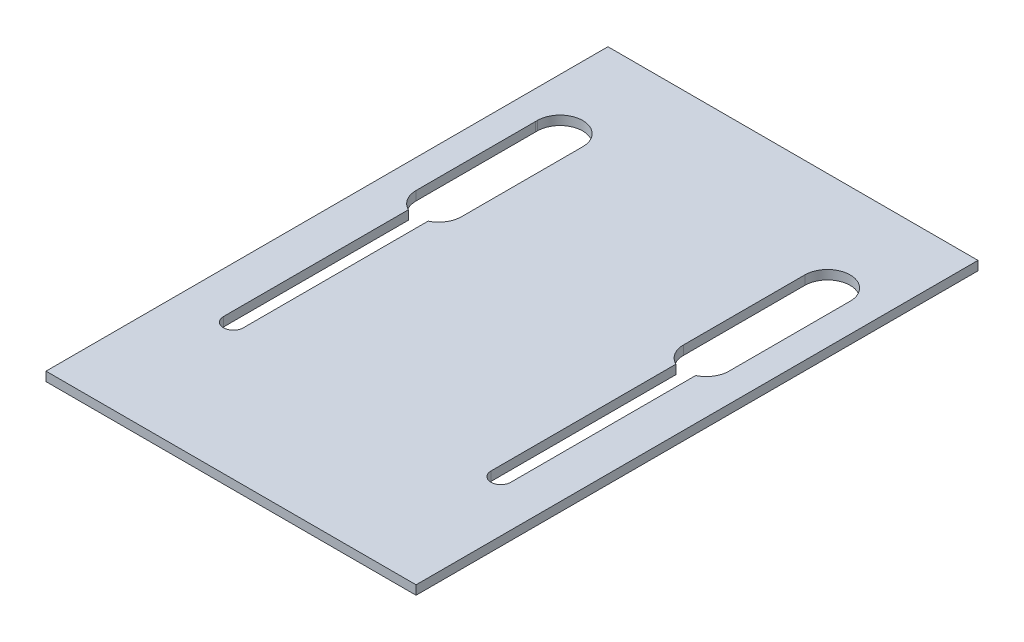
ISO-10303-21;
HEADER;
FILE_DESCRIPTION(('STEP AP214'),'2;1');
FILE_NAME('part.step','',(''),(''),'','','');
FILE_SCHEMA(('AUTOMOTIVE_DESIGN { 1 0 10303 214 1 1 1 1 }'));
ENDSEC;
DATA;
#1=APPLICATION_CONTEXT('core data for automotive mechanical design processes');
#2=APPLICATION_PROTOCOL_DEFINITION('international standard','automotive_design',2000,#1);
#3=PRODUCT_CONTEXT('',#1,'mechanical');
#4=PRODUCT('Part','Part','',(#3));
#5=PRODUCT_RELATED_PRODUCT_CATEGORY('part','',(#4));
#6=PRODUCT_DEFINITION_FORMATION('','',#4);
#7=PRODUCT_DEFINITION_CONTEXT('part definition',#1,'design');
#8=PRODUCT_DEFINITION('design','',#6,#7);
#9=PRODUCT_DEFINITION_SHAPE('','',#8);
#10=(LENGTH_UNIT() NAMED_UNIT(*) SI_UNIT(.MILLI.,.METRE.));
#11=(NAMED_UNIT(*) PLANE_ANGLE_UNIT() SI_UNIT($,.RADIAN.));
#12=(NAMED_UNIT(*) SI_UNIT($,.STERADIAN.) SOLID_ANGLE_UNIT());
#13=UNCERTAINTY_MEASURE_WITH_UNIT(LENGTH_MEASURE(1.E-05),#10,'distance_accuracy_value','');
#14=(GEOMETRIC_REPRESENTATION_CONTEXT(3) GLOBAL_UNCERTAINTY_ASSIGNED_CONTEXT((#13)) GLOBAL_UNIT_ASSIGNED_CONTEXT((#10,
#11,#12)) REPRESENTATION_CONTEXT('',''));
#15=CARTESIAN_POINT('',(0.,0.,0.));
#16=DIRECTION('',(0.,0.,1.));
#17=DIRECTION('',(1.,0.,0.));
#18=AXIS2_PLACEMENT_3D('',#15,#16,#17);
#19=CARTESIAN_POINT('',(0.,3.,0.));
#20=DIRECTION('',(0.,-1.,0.));
#21=DIRECTION('',(0.,0.,-1.));
#22=AXIS2_PLACEMENT_3D('',#19,#20,#21);
#23=PLANE('',#22);
#24=DIRECTION('',(0.,0.,1.));
#25=VECTOR('',#24,1.);
#26=CARTESIAN_POINT('',(13.67,3.,-145.3));
#27=LINE('',#26,#25);
#28=CARTESIAN_POINT('',(13.67,3.,-106.308017416818));
#29=VERTEX_POINT('',#28);
#30=CARTESIAN_POINT('',(13.67,3.,-45.3));
#31=VERTEX_POINT('',#30);
#32=EDGE_CURVE('E443',#29,#31,#27,.T.);
#33=ORIENTED_EDGE('',*,*,#32,.F.);
#34=CARTESIAN_POINT('',(16.9244225733938,3.,-113.06514208));
#35=DIRECTION('',(0.,1.,0.));
#36=DIRECTION('',(0.,0.,1.));
#37=AXIS2_PLACEMENT_3D('',#34,#35,#36);
#38=CIRCLE('',#37,7.5);
#39=CARTESIAN_POINT('',(9.42442257339383,3.,-113.06514208));
#40=VERTEX_POINT('',#39);
#41=EDGE_CURVE('E131',#40,#29,#38,.T.);
#42=ORIENTED_EDGE('',*,*,#41,.F.);
#43=DIRECTION('',(0.,0.,1.));
#44=VECTOR('',#43,1.);
#45=CARTESIAN_POINT('',(9.42442257339387,3.,0.));
#46=LINE('',#45,#44);
#47=CARTESIAN_POINT('',(9.42442257339382,3.,-152.542475162843));
#48=VERTEX_POINT('',#47);
#49=EDGE_CURVE('E334',#48,#40,#46,.T.);
#50=ORIENTED_EDGE('',*,*,#49,.F.);
#51=CARTESIAN_POINT('',(16.92,3.,-152.8));
#52=DIRECTION('',(0.,1.,0.));
#53=DIRECTION('',(0.,0.,1.));
#54=AXIS2_PLACEMENT_3D('',#51,#52,#53);
#55=CIRCLE('',#54,7.50000000000001);
#56=CARTESIAN_POINT('',(9.42442257339382,3.,-153.057524837157));
#57=VERTEX_POINT('',#56);
#58=EDGE_CURVE('E464',#57,#48,#55,.T.);
#59=ORIENTED_EDGE('',*,*,#58,.F.);
#60=CARTESIAN_POINT('',(9.42442257339382,3.,-153.06514208));
#61=VERTEX_POINT('',#60);
#62=EDGE_CURVE('E335',#61,#57,#46,.T.);
#63=ORIENTED_EDGE('',*,*,#62,.F.);
#64=CARTESIAN_POINT('',(16.9244225733938,3.,-153.06514208));
#65=DIRECTION('',(0.,1.,0.));
#66=DIRECTION('',(0.,0.,1.));
#67=AXIS2_PLACEMENT_3D('',#64,#65,#66);
#68=CIRCLE('',#67,7.5);
#69=CARTESIAN_POINT('',(24.4244225733938,3.,-153.06514208));
#70=VERTEX_POINT('',#69);
#71=EDGE_CURVE('E330',#70,#61,#68,.T.);
#72=ORIENTED_EDGE('',*,*,#71,.F.);
#73=DIRECTION('',(0.,0.,1.));
#74=VECTOR('',#73,1.);
#75=CARTESIAN_POINT('',(24.4244225733939,3.,0.));
#76=LINE('',#75,#74);
#77=CARTESIAN_POINT('',(24.4244225733938,3.,-113.06514208));
#78=VERTEX_POINT('',#77);
#79=EDGE_CURVE('E326',#70,#78,#76,.T.);
#80=ORIENTED_EDGE('',*,*,#79,.T.);
#81=CARTESIAN_POINT('',(20.1699999999999,3.,-106.303764471265));
#82=VERTEX_POINT('',#81);
#83=EDGE_CURVE('E303',#82,#78,#38,.T.);
#84=ORIENTED_EDGE('',*,*,#83,.F.);
#85=DIRECTION('',(0.,0.,1.));
#86=VECTOR('',#85,1.);
#87=CARTESIAN_POINT('',(20.1699999999999,3.,-145.3));
#88=LINE('',#87,#86);
#89=CARTESIAN_POINT('',(20.1699999999999,3.,-45.3));
#90=VERTEX_POINT('',#89);
#91=EDGE_CURVE('E465',#82,#90,#88,.T.);
#92=ORIENTED_EDGE('',*,*,#91,.T.);
#93=CARTESIAN_POINT('',(16.92,3.,-45.3));
#94=DIRECTION('',(0.,1.,0.));
#95=DIRECTION('',(0.,0.,1.));
#96=AXIS2_PLACEMENT_3D('',#93,#94,#95);
#97=CIRCLE('',#96,3.24999999999998);
#98=EDGE_CURVE('E468',#31,#90,#97,.T.);
#99=ORIENTED_EDGE('',*,*,#98,.F.);
#100=EDGE_LOOP('',(#33,#42,#50,#59,#63,#72,#80,#84,#92,#99));
#101=FACE_BOUND('',#100,.T.);
#102=DIRECTION('',(0.,0.,1.));
#103=VECTOR('',#102,1.);
#104=CARTESIAN_POINT('',(0.,3.,0.));
#105=LINE('',#104,#103);
#106=CARTESIAN_POINT('',(0.,3.,-185.8));
#107=VERTEX_POINT('',#106);
#108=CARTESIAN_POINT('',(0.,3.,-0.399999999999998));
#109=VERTEX_POINT('',#108);
#110=EDGE_CURVE('E280',#107,#109,#105,.T.);
#111=ORIENTED_EDGE('',*,*,#110,.T.);
#112=DIRECTION('',(-1.,0.,0.));
#113=VECTOR('',#112,1.);
#114=CARTESIAN_POINT('',(122.1,3.,-0.399999999999998));
#115=LINE('',#114,#113);
#116=CARTESIAN_POINT('',(122.1,3.,-0.399999999999998));
#117=VERTEX_POINT('',#116);
#118=EDGE_CURVE('E283',#117,#109,#115,.T.);
#119=ORIENTED_EDGE('',*,*,#118,.F.);
#120=DIRECTION('',(0.,0.,-1.));
#121=VECTOR('',#120,1.);
#122=CARTESIAN_POINT('',(122.1,3.,0.));
#123=LINE('',#122,#121);
#124=CARTESIAN_POINT('',(122.1,3.,-185.8));
#125=VERTEX_POINT('',#124);
#126=EDGE_CURVE('E269',#117,#125,#123,.T.);
#127=ORIENTED_EDGE('',*,*,#126,.T.);
#128=DIRECTION('',(1.,0.,0.));
#129=VECTOR('',#128,1.);
#130=CARTESIAN_POINT('',(0.,3.,-185.8));
#131=LINE('',#130,#129);
#132=EDGE_CURVE('E410',#107,#125,#131,.T.);
#133=ORIENTED_EDGE('',*,*,#132,.F.);
#134=EDGE_LOOP('',(#111,#119,#127,#133));
#135=FACE_BOUND('',#134,.T.);
#136=CARTESIAN_POINT('',(105.175577426606,3.,-113.06514208));
#137=DIRECTION('',(0.,1.,0.));
#138=DIRECTION('',(0.,0.,1.));
#139=AXIS2_PLACEMENT_3D('',#136,#137,#138);
#140=CIRCLE('',#139,7.50000000000001);
#141=CARTESIAN_POINT('',(112.675577426606,3.,-113.06514208));
#142=VERTEX_POINT('',#141);
#143=CARTESIAN_POINT('',(108.43,3.,-106.308017416818));
#144=VERTEX_POINT('',#143);
#145=EDGE_CURVE('E304',#142,#144,#140,.F.);
#146=ORIENTED_EDGE('',*,*,#145,.T.);
#147=DIRECTION('',(0.,0.,1.));
#148=VECTOR('',#147,1.);
#149=CARTESIAN_POINT('',(108.43,3.,-145.3));
#150=LINE('',#149,#148);
#151=CARTESIAN_POINT('',(108.43,3.,-45.3));
#152=VERTEX_POINT('',#151);
#153=EDGE_CURVE('E439',#144,#152,#150,.T.);
#154=ORIENTED_EDGE('',*,*,#153,.T.);
#155=CARTESIAN_POINT('',(105.18,3.,-45.3));
#156=DIRECTION('',(0.,-1.,0.));
#157=DIRECTION('',(0.,0.,-1.));
#158=AXIS2_PLACEMENT_3D('',#155,#156,#157);
#159=CIRCLE('',#158,3.24999999999998);
#160=CARTESIAN_POINT('',(101.93,3.,-45.3));
#161=VERTEX_POINT('',#160);
#162=EDGE_CURVE('E442',#152,#161,#159,.T.);
#163=ORIENTED_EDGE('',*,*,#162,.T.);
#164=DIRECTION('',(0.,0.,1.));
#165=VECTOR('',#164,1.);
#166=CARTESIAN_POINT('',(101.93,3.,-145.3));
#167=LINE('',#166,#165);
#168=CARTESIAN_POINT('',(101.93,3.,-106.303764471265));
#169=VERTEX_POINT('',#168);
#170=EDGE_CURVE('E431',#169,#161,#167,.T.);
#171=ORIENTED_EDGE('',*,*,#170,.F.);
#172=CARTESIAN_POINT('',(105.175577426606,3.,-113.06514208));
#173=DIRECTION('',(0.,1.,0.));
#174=DIRECTION('',(0.,0.,1.));
#175=AXIS2_PLACEMENT_3D('',#172,#173,#174);
#176=CIRCLE('',#175,7.50000000000001);
#177=CARTESIAN_POINT('',(97.6755774266061,3.,-113.06514208));
#178=VERTEX_POINT('',#177);
#179=EDGE_CURVE('E317',#169,#178,#176,.F.);
#180=ORIENTED_EDGE('',*,*,#179,.T.);
#181=DIRECTION('',(0.,0.,1.));
#182=VECTOR('',#181,1.);
#183=CARTESIAN_POINT('',(97.675577426606,3.,0.));
#184=LINE('',#183,#182);
#185=CARTESIAN_POINT('',(97.6755774266061,3.,-153.06514208));
#186=VERTEX_POINT('',#185);
#187=EDGE_CURVE('E360',#186,#178,#184,.T.);
#188=ORIENTED_EDGE('',*,*,#187,.F.);
#189=CARTESIAN_POINT('',(105.175577426606,3.,-153.06514208));
#190=DIRECTION('',(0.,1.,0.));
#191=DIRECTION('',(0.,0.,1.));
#192=AXIS2_PLACEMENT_3D('',#189,#190,#191);
#193=CIRCLE('',#192,7.5);
#194=CARTESIAN_POINT('',(112.675577426606,3.,-153.06514208));
#195=VERTEX_POINT('',#194);
#196=EDGE_CURVE('E356',#186,#195,#193,.F.);
#197=ORIENTED_EDGE('',*,*,#196,.T.);
#198=DIRECTION('',(0.,0.,1.));
#199=VECTOR('',#198,1.);
#200=CARTESIAN_POINT('',(112.675577426606,3.,0.));
#201=LINE('',#200,#199);
#202=CARTESIAN_POINT('',(112.675577426606,3.,-153.057524837159));
#203=VERTEX_POINT('',#202);
#204=EDGE_CURVE('E352',#195,#203,#201,.T.);
#205=ORIENTED_EDGE('',*,*,#204,.T.);
#206=CARTESIAN_POINT('',(105.18,3.,-152.8));
#207=DIRECTION('',(0.,-1.,0.));
#208=DIRECTION('',(0.,0.,-1.));
#209=AXIS2_PLACEMENT_3D('',#206,#207,#208);
#210=CIRCLE('',#209,7.50000000000003);
#211=CARTESIAN_POINT('',(112.675577426606,3.,-152.542475162841));
#212=VERTEX_POINT('',#211);
#213=EDGE_CURVE('E422',#203,#212,#210,.T.);
#214=ORIENTED_EDGE('',*,*,#213,.T.);
#215=DIRECTION('',(0.,0.,1.));
#216=VECTOR('',#215,1.);
#217=CARTESIAN_POINT('',(112.675577426606,3.,0.));
#218=LINE('',#217,#216);
#219=EDGE_CURVE('E308',#212,#142,#218,.T.);
#220=ORIENTED_EDGE('',*,*,#219,.T.);
#221=EDGE_LOOP('',(#146,#154,#163,#171,#180,#188,#197,#205,#214,#220));
#222=FACE_BOUND('',#221,.T.);
#223=ADVANCED_FACE('F107',(#101,#135,#222),#23,.F.);
#224=CARTESIAN_POINT('',(0.,0.,0.));
#225=DIRECTION('',(0.,-1.,0.));
#226=DIRECTION('',(0.,0.,-1.));
#227=AXIS2_PLACEMENT_3D('',#224,#225,#226);
#228=PLANE('',#227);
#229=CARTESIAN_POINT('',(16.9244225733938,0.,-113.06514208));
#230=DIRECTION('',(0.,-1.,0.));
#231=DIRECTION('',(0.,0.,-1.));
#232=AXIS2_PLACEMENT_3D('',#229,#230,#231);
#233=CIRCLE('',#232,7.5);
#234=CARTESIAN_POINT('',(13.67,0.,-106.308017416818));
#235=VERTEX_POINT('',#234);
#236=CARTESIAN_POINT('',(9.42442257339383,0.,-113.06514208));
#237=VERTEX_POINT('',#236);
#238=EDGE_CURVE('E396',#235,#237,#233,.T.);
#239=ORIENTED_EDGE('',*,*,#238,.F.);
#240=DIRECTION('',(0.,0.,1.));
#241=VECTOR('',#240,1.);
#242=CARTESIAN_POINT('',(13.67,0.,-145.3));
#243=LINE('',#242,#241);
#244=CARTESIAN_POINT('',(13.67,0.,-45.3));
#245=VERTEX_POINT('',#244);
#246=EDGE_CURVE('E469',#235,#245,#243,.T.);
#247=ORIENTED_EDGE('',*,*,#246,.T.);
#248=CARTESIAN_POINT('',(16.92,0.,-45.3));
#249=DIRECTION('',(0.,1.,0.));
#250=DIRECTION('',(0.,0.,1.));
#251=AXIS2_PLACEMENT_3D('',#248,#249,#250);
#252=CIRCLE('',#251,3.24999999999998);
#253=CARTESIAN_POINT('',(20.1699999999999,0.,-45.3));
#254=VERTEX_POINT('',#253);
#255=EDGE_CURVE('E477',#245,#254,#252,.T.);
#256=ORIENTED_EDGE('',*,*,#255,.T.);
#257=DIRECTION('',(0.,0.,1.));
#258=VECTOR('',#257,1.);
#259=CARTESIAN_POINT('',(20.1699999999999,0.,-145.3));
#260=LINE('',#259,#258);
#261=CARTESIAN_POINT('',(20.1699999999999,0.,-106.303764471265));
#262=VERTEX_POINT('',#261);
#263=EDGE_CURVE('E459',#262,#254,#260,.T.);
#264=ORIENTED_EDGE('',*,*,#263,.F.);
#265=CARTESIAN_POINT('',(24.4244225733938,0.,-113.06514208));
#266=VERTEX_POINT('',#265);
#267=EDGE_CURVE('E123',#266,#262,#233,.T.);
#268=ORIENTED_EDGE('',*,*,#267,.F.);
#269=DIRECTION('',(0.,0.,-1.));
#270=VECTOR('',#269,1.);
#271=CARTESIAN_POINT('',(24.4244225733939,0.,0.));
#272=LINE('',#271,#270);
#273=CARTESIAN_POINT('',(24.4244225733938,0.,-153.06514208));
#274=VERTEX_POINT('',#273);
#275=EDGE_CURVE('E116',#266,#274,#272,.T.);
#276=ORIENTED_EDGE('',*,*,#275,.T.);
#277=CARTESIAN_POINT('',(16.9244225733938,0.,-153.06514208));
#278=DIRECTION('',(0.,-1.,0.));
#279=DIRECTION('',(0.,0.,-1.));
#280=AXIS2_PLACEMENT_3D('',#277,#278,#279);
#281=CIRCLE('',#280,7.5);
#282=CARTESIAN_POINT('',(9.42442257339382,0.,-153.06514208));
#283=VERTEX_POINT('',#282);
#284=EDGE_CURVE('E12',#283,#274,#281,.T.);
#285=ORIENTED_EDGE('',*,*,#284,.F.);
#286=DIRECTION('',(0.,0.,-1.));
#287=VECTOR('',#286,1.);
#288=CARTESIAN_POINT('',(9.42442257339387,0.,0.));
#289=LINE('',#288,#287);
#290=CARTESIAN_POINT('',(9.42442257339382,0.,-153.057524837157));
#291=VERTEX_POINT('',#290);
#292=EDGE_CURVE('E402',#291,#283,#289,.T.);
#293=ORIENTED_EDGE('',*,*,#292,.F.);
#294=CARTESIAN_POINT('',(16.92,0.,-152.8));
#295=DIRECTION('',(0.,1.,0.));
#296=DIRECTION('',(0.,0.,1.));
#297=AXIS2_PLACEMENT_3D('',#294,#295,#296);
#298=CIRCLE('',#297,7.50000000000001);
#299=CARTESIAN_POINT('',(9.42442257339382,0.,-152.542475162843));
#300=VERTEX_POINT('',#299);
#301=EDGE_CURVE('E416',#291,#300,#298,.T.);
#302=ORIENTED_EDGE('',*,*,#301,.T.);
#303=EDGE_CURVE('E405',#237,#300,#289,.T.);
#304=ORIENTED_EDGE('',*,*,#303,.F.);
#305=EDGE_LOOP('',(#239,#247,#256,#264,#268,#276,#285,#293,#302,#304));
#306=FACE_BOUND('',#305,.T.);
#307=DIRECTION('',(0.,0.,-1.));
#308=VECTOR('',#307,1.);
#309=CARTESIAN_POINT('',(122.1,0.,0.));
#310=LINE('',#309,#308);
#311=CARTESIAN_POINT('',(122.1,0.,-0.399999999999998));
#312=VERTEX_POINT('',#311);
#313=CARTESIAN_POINT('',(122.1,0.,-185.8));
#314=VERTEX_POINT('',#313);
#315=EDGE_CURVE('E490',#312,#314,#310,.T.);
#316=ORIENTED_EDGE('',*,*,#315,.F.);
#317=DIRECTION('',(1.,0.,0.));
#318=VECTOR('',#317,1.);
#319=CARTESIAN_POINT('',(122.1,0.,-0.399999999999998));
#320=LINE('',#319,#318);
#321=CARTESIAN_POINT('',(0.,0.,-0.399999999999998));
#322=VERTEX_POINT('',#321);
#323=EDGE_CURVE('E295',#322,#312,#320,.T.);
#324=ORIENTED_EDGE('',*,*,#323,.F.);
#325=DIRECTION('',(0.,0.,1.));
#326=VECTOR('',#325,1.);
#327=CARTESIAN_POINT('',(0.,0.,0.));
#328=LINE('',#327,#326);
#329=CARTESIAN_POINT('',(0.,0.,-185.8));
#330=VERTEX_POINT('',#329);
#331=EDGE_CURVE('E421',#330,#322,#328,.T.);
#332=ORIENTED_EDGE('',*,*,#331,.F.);
#333=DIRECTION('',(1.,0.,0.));
#334=VECTOR('',#333,1.);
#335=CARTESIAN_POINT('',(0.,0.,-185.8));
#336=LINE('',#335,#334);
#337=EDGE_CURVE('E406',#330,#314,#336,.T.);
#338=ORIENTED_EDGE('',*,*,#337,.T.);
#339=EDGE_LOOP('',(#316,#324,#332,#338));
#340=FACE_BOUND('',#339,.T.);
#341=DIRECTION('',(0.,0.,1.));
#342=VECTOR('',#341,1.);
#343=CARTESIAN_POINT('',(108.43,0.,-145.3));
#344=LINE('',#343,#342);
#345=CARTESIAN_POINT('',(108.43,0.,-106.308017416818));
#346=VERTEX_POINT('',#345);
#347=CARTESIAN_POINT('',(108.43,0.,-45.3));
#348=VERTEX_POINT('',#347);
#349=EDGE_CURVE('E427',#346,#348,#344,.T.);
#350=ORIENTED_EDGE('',*,*,#349,.F.);
#351=CARTESIAN_POINT('',(105.175577426606,0.,-113.06514208));
#352=DIRECTION('',(0.,-1.,0.));
#353=DIRECTION('',(0.,0.,-1.));
#354=AXIS2_PLACEMENT_3D('',#351,#352,#353);
#355=CIRCLE('',#354,7.50000000000001);
#356=CARTESIAN_POINT('',(112.675577426606,0.,-113.06514208));
#357=VERTEX_POINT('',#356);
#358=EDGE_CURVE('E384',#346,#357,#355,.F.);
#359=ORIENTED_EDGE('',*,*,#358,.T.);
#360=DIRECTION('',(0.,0.,-1.));
#361=VECTOR('',#360,1.);
#362=CARTESIAN_POINT('',(112.675577426606,0.,0.));
#363=LINE('',#362,#361);
#364=CARTESIAN_POINT('',(112.675577426606,0.,-152.542475162841));
#365=VERTEX_POINT('',#364);
#366=EDGE_CURVE('E392',#357,#365,#363,.T.);
#367=ORIENTED_EDGE('',*,*,#366,.T.);
#368=CARTESIAN_POINT('',(105.18,0.,-152.8));
#369=DIRECTION('',(0.,-1.,0.));
#370=DIRECTION('',(0.,0.,-1.));
#371=AXIS2_PLACEMENT_3D('',#368,#369,#370);
#372=CIRCLE('',#371,7.50000000000003);
#373=CARTESIAN_POINT('',(112.675577426606,0.,-153.057524837159));
#374=VERTEX_POINT('',#373);
#375=EDGE_CURVE('E417',#374,#365,#372,.T.);
#376=ORIENTED_EDGE('',*,*,#375,.F.);
#377=DIRECTION('',(0.,0.,-1.));
#378=VECTOR('',#377,1.);
#379=CARTESIAN_POINT('',(112.675577426606,0.,0.));
#380=LINE('',#379,#378);
#381=CARTESIAN_POINT('',(112.675577426606,0.,-153.06514208));
#382=VERTEX_POINT('',#381);
#383=EDGE_CURVE('E388',#374,#382,#380,.T.);
#384=ORIENTED_EDGE('',*,*,#383,.T.);
#385=CARTESIAN_POINT('',(105.175577426606,0.,-153.06514208));
#386=DIRECTION('',(0.,-1.,0.));
#387=DIRECTION('',(0.,0.,-1.));
#388=AXIS2_PLACEMENT_3D('',#385,#386,#387);
#389=CIRCLE('',#388,7.5);
#390=CARTESIAN_POINT('',(97.6755774266061,0.,-153.06514208));
#391=VERTEX_POINT('',#390);
#392=EDGE_CURVE('E509',#382,#391,#389,.F.);
#393=ORIENTED_EDGE('',*,*,#392,.T.);
#394=DIRECTION('',(0.,0.,-1.));
#395=VECTOR('',#394,1.);
#396=CARTESIAN_POINT('',(97.675577426606,0.,0.));
#397=LINE('',#396,#395);
#398=CARTESIAN_POINT('',(97.6755774266061,0.,-113.06514208));
#399=VERTEX_POINT('',#398);
#400=EDGE_CURVE('E513',#399,#391,#397,.T.);
#401=ORIENTED_EDGE('',*,*,#400,.F.);
#402=CARTESIAN_POINT('',(105.175577426606,0.,-113.06514208));
#403=DIRECTION('',(0.,-1.,0.));
#404=DIRECTION('',(0.,0.,-1.));
#405=AXIS2_PLACEMENT_3D('',#402,#403,#404);
#406=CIRCLE('',#405,7.50000000000001);
#407=CARTESIAN_POINT('',(101.93,0.,-106.303764471265));
#408=VERTEX_POINT('',#407);
#409=EDGE_CURVE('E368',#399,#408,#406,.F.);
#410=ORIENTED_EDGE('',*,*,#409,.T.);
#411=DIRECTION('',(0.,0.,1.));
#412=VECTOR('',#411,1.);
#413=CARTESIAN_POINT('',(101.93,0.,-145.3));
#414=LINE('',#413,#412);
#415=CARTESIAN_POINT('',(101.93,0.,-45.3));
#416=VERTEX_POINT('',#415);
#417=EDGE_CURVE('E435',#408,#416,#414,.T.);
#418=ORIENTED_EDGE('',*,*,#417,.T.);
#419=CARTESIAN_POINT('',(105.18,0.,-45.3));
#420=DIRECTION('',(0.,-1.,0.));
#421=DIRECTION('',(0.,0.,-1.));
#422=AXIS2_PLACEMENT_3D('',#419,#420,#421);
#423=CIRCLE('',#422,3.24999999999998);
#424=EDGE_CURVE('E430',#348,#416,#423,.T.);
#425=ORIENTED_EDGE('',*,*,#424,.F.);
#426=EDGE_LOOP('',(#350,#359,#367,#376,#384,#393,#401,#410,#418,#425));
#427=FACE_BOUND('',#426,.T.);
#428=ADVANCED_FACE('F520',(#306,#340,#427),#228,.T.);
#429=CARTESIAN_POINT('',(105.18,0.,-152.8));
#430=DIRECTION('',(0.,1.,0.));
#431=DIRECTION('',(0.,0.,1.));
#432=AXIS2_PLACEMENT_3D('',#429,#430,#431);
#433=CYLINDRICAL_SURFACE('',#432,7.50000000000003);
#434=ORIENTED_EDGE('',*,*,#375,.T.);
#435=DIRECTION('',(0.,1.,0.));
#436=VECTOR('',#435,1.);
#437=CARTESIAN_POINT('',(112.675577426606,-7.,-152.542475162841));
#438=LINE('',#437,#436);
#439=EDGE_CURVE('E318',#365,#212,#438,.T.);
#440=ORIENTED_EDGE('',*,*,#439,.T.);
#441=ORIENTED_EDGE('',*,*,#213,.F.);
#442=DIRECTION('',(0.,1.,0.));
#443=VECTOR('',#442,1.);
#444=CARTESIAN_POINT('',(112.675577426606,-7.,-153.057524837159));
#445=LINE('',#444,#443);
#446=EDGE_CURVE('E375',#374,#203,#445,.T.);
#447=ORIENTED_EDGE('',*,*,#446,.F.);
#448=EDGE_LOOP('',(#434,#440,#441,#447));
#449=FACE_BOUND('',#448,.T.);
#450=ADVANCED_FACE('F584',(#449),#433,.F.);
#451=CARTESIAN_POINT('',(108.43,0.,-145.3));
#452=DIRECTION('',(-1.,0.,0.));
#453=DIRECTION('',(0.,0.,1.));
#454=AXIS2_PLACEMENT_3D('',#451,#452,#453);
#455=PLANE('',#454);
#456=ORIENTED_EDGE('',*,*,#153,.F.);
#457=DIRECTION('',(0.,1.,0.));
#458=VECTOR('',#457,1.);
#459=CARTESIAN_POINT('',(108.43,-7.,-106.308017416818));
#460=LINE('',#459,#458);
#461=EDGE_CURVE('E314',#346,#144,#460,.T.);
#462=ORIENTED_EDGE('',*,*,#461,.F.);
#463=ORIENTED_EDGE('',*,*,#349,.T.);
#464=DIRECTION('',(0.,1.,0.));
#465=VECTOR('',#464,1.);
#466=CARTESIAN_POINT('',(108.43,0.,-45.3));
#467=LINE('',#466,#465);
#468=EDGE_CURVE('E426',#348,#152,#467,.T.);
#469=ORIENTED_EDGE('',*,*,#468,.T.);
#470=EDGE_LOOP('',(#456,#462,#463,#469));
#471=FACE_BOUND('',#470,.T.);
#472=ADVANCED_FACE('F606',(#471),#455,.T.);
#473=CARTESIAN_POINT('',(101.93,0.,-145.3));
#474=DIRECTION('',(-1.,0.,0.));
#475=DIRECTION('',(0.,0.,1.));
#476=AXIS2_PLACEMENT_3D('',#473,#474,#475);
#477=PLANE('',#476);
#478=DIRECTION('',(0.,1.,0.));
#479=VECTOR('',#478,1.);
#480=CARTESIAN_POINT('',(101.93,-7.,-106.303764471265));
#481=LINE('',#480,#479);
#482=EDGE_CURVE('E364',#408,#169,#481,.T.);
#483=ORIENTED_EDGE('',*,*,#482,.T.);
#484=ORIENTED_EDGE('',*,*,#170,.T.);
#485=DIRECTION('',(0.,1.,0.));
#486=VECTOR('',#485,1.);
#487=CARTESIAN_POINT('',(101.93,0.,-45.3));
#488=LINE('',#487,#486);
#489=EDGE_CURVE('E438',#416,#161,#488,.T.);
#490=ORIENTED_EDGE('',*,*,#489,.F.);
#491=ORIENTED_EDGE('',*,*,#417,.F.);
#492=EDGE_LOOP('',(#483,#484,#490,#491));
#493=FACE_BOUND('',#492,.T.);
#494=ADVANCED_FACE('F595',(#493),#477,.F.);
#495=CARTESIAN_POINT('',(0.,3.,0.));
#496=DIRECTION('',(1.,0.,0.));
#497=DIRECTION('',(0.,0.,-1.));
#498=AXIS2_PLACEMENT_3D('',#495,#496,#497);
#499=PLANE('',#498);
#500=ORIENTED_EDGE('',*,*,#331,.T.);
#501=DIRECTION('',(0.,-1.,0.));
#502=VECTOR('',#501,1.);
#503=CARTESIAN_POINT('',(0.,3.,-0.399999999999998));
#504=LINE('',#503,#502);
#505=EDGE_CURVE('E290',#109,#322,#504,.T.);
#506=ORIENTED_EDGE('',*,*,#505,.F.);
#507=ORIENTED_EDGE('',*,*,#110,.F.);
#508=DIRECTION('',(0.,1.,0.));
#509=VECTOR('',#508,1.);
#510=CARTESIAN_POINT('',(0.,3.,-185.8));
#511=LINE('',#510,#509);
#512=EDGE_CURVE('E413',#330,#107,#511,.T.);
#513=ORIENTED_EDGE('',*,*,#512,.F.);
#514=EDGE_LOOP('',(#500,#506,#507,#513));
#515=FACE_BOUND('',#514,.T.);
#516=ADVANCED_FACE('F109',(#515),#499,.F.);
#517=CARTESIAN_POINT('',(122.1,3.,0.));
#518=DIRECTION('',(-1.,0.,0.));
#519=DIRECTION('',(0.,0.,1.));
#520=AXIS2_PLACEMENT_3D('',#517,#518,#519);
#521=PLANE('',#520);
#522=ORIENTED_EDGE('',*,*,#126,.F.);
#523=DIRECTION('',(0.,1.,0.));
#524=VECTOR('',#523,1.);
#525=CARTESIAN_POINT('',(122.1,3.,-0.399999999999998));
#526=LINE('',#525,#524);
#527=EDGE_CURVE('E273',#312,#117,#526,.T.);
#528=ORIENTED_EDGE('',*,*,#527,.F.);
#529=ORIENTED_EDGE('',*,*,#315,.T.);
#530=DIRECTION('',(0.,-1.,0.));
#531=VECTOR('',#530,1.);
#532=CARTESIAN_POINT('',(122.1,3.,-185.8));
#533=LINE('',#532,#531);
#534=EDGE_CURVE('E275',#125,#314,#533,.T.);
#535=ORIENTED_EDGE('',*,*,#534,.F.);
#536=EDGE_LOOP('',(#522,#528,#529,#535));
#537=FACE_BOUND('',#536,.T.);
#538=ADVANCED_FACE('F271',(#537),#521,.F.);
#539=CARTESIAN_POINT('',(16.92,0.,-152.8));
#540=DIRECTION('',(0.,1.,0.));
#541=DIRECTION('',(0.,0.,1.));
#542=AXIS2_PLACEMENT_3D('',#539,#540,#541);
#543=CYLINDRICAL_SURFACE('',#542,7.50000000000001);
#544=ORIENTED_EDGE('',*,*,#58,.T.);
#545=DIRECTION('',(0.,1.,0.));
#546=VECTOR('',#545,1.);
#547=CARTESIAN_POINT('',(9.42442257339382,0.,-152.542475162843));
#548=LINE('',#547,#546);
#549=EDGE_CURVE('E505',#48,#300,#548,.F.);
#550=ORIENTED_EDGE('',*,*,#549,.T.);
#551=ORIENTED_EDGE('',*,*,#301,.F.);
#552=DIRECTION('',(0.,1.,0.));
#553=VECTOR('',#552,1.);
#554=CARTESIAN_POINT('',(9.42442257339382,0.,-153.057524837157));
#555=LINE('',#554,#553);
#556=EDGE_CURVE('E501',#291,#57,#555,.T.);
#557=ORIENTED_EDGE('',*,*,#556,.T.);
#558=EDGE_LOOP('',(#544,#550,#551,#557));
#559=FACE_BOUND('',#558,.T.);
#560=ADVANCED_FACE('F546',(#559),#543,.F.);
#561=CARTESIAN_POINT('',(20.1699999999999,0.,-145.3));
#562=DIRECTION('',(-1.,0.,0.));
#563=DIRECTION('',(0.,0.,1.));
#564=AXIS2_PLACEMENT_3D('',#561,#562,#563);
#565=PLANE('',#564);
#566=DIRECTION('',(0.,1.,0.));
#567=VECTOR('',#566,1.);
#568=CARTESIAN_POINT('',(20.1699999999999,-7.,-106.303764471265));
#569=LINE('',#568,#567);
#570=EDGE_CURVE('E399',#262,#82,#569,.T.);
#571=ORIENTED_EDGE('',*,*,#570,.F.);
#572=ORIENTED_EDGE('',*,*,#263,.T.);
#573=DIRECTION('',(0.,1.,0.));
#574=VECTOR('',#573,1.);
#575=CARTESIAN_POINT('',(20.1699999999999,0.,-45.3));
#576=LINE('',#575,#574);
#577=EDGE_CURVE('E460',#254,#90,#576,.T.);
#578=ORIENTED_EDGE('',*,*,#577,.T.);
#579=ORIENTED_EDGE('',*,*,#91,.F.);
#580=EDGE_LOOP('',(#571,#572,#578,#579));
#581=FACE_BOUND('',#580,.T.);
#582=ADVANCED_FACE('F589',(#581),#565,.T.);
#583=CARTESIAN_POINT('',(16.92,0.,-45.3));
#584=DIRECTION('',(0.,1.,0.));
#585=DIRECTION('',(0.,0.,1.));
#586=AXIS2_PLACEMENT_3D('',#583,#584,#585);
#587=CYLINDRICAL_SURFACE('',#586,3.24999999999998);
#588=ORIENTED_EDGE('',*,*,#98,.T.);
#589=ORIENTED_EDGE('',*,*,#577,.F.);
#590=ORIENTED_EDGE('',*,*,#255,.F.);
#591=DIRECTION('',(0.,1.,0.));
#592=VECTOR('',#591,1.);
#593=CARTESIAN_POINT('',(13.67,0.,-45.3));
#594=LINE('',#593,#592);
#595=EDGE_CURVE('E455',#245,#31,#594,.T.);
#596=ORIENTED_EDGE('',*,*,#595,.T.);
#597=EDGE_LOOP('',(#588,#589,#590,#596));
#598=FACE_BOUND('',#597,.T.);
#599=ADVANCED_FACE('F562',(#598),#587,.F.);
#600=CARTESIAN_POINT('',(13.67,0.,-145.3));
#601=DIRECTION('',(-1.,0.,0.));
#602=DIRECTION('',(0.,0.,1.));
#603=AXIS2_PLACEMENT_3D('',#600,#601,#602);
#604=PLANE('',#603);
#605=ORIENTED_EDGE('',*,*,#246,.F.);
#606=DIRECTION('',(0.,1.,0.));
#607=VECTOR('',#606,1.);
#608=CARTESIAN_POINT('',(13.67,-7.,-106.308017416818));
#609=LINE('',#608,#607);
#610=EDGE_CURVE('E498',#235,#29,#609,.T.);
#611=ORIENTED_EDGE('',*,*,#610,.T.);
#612=ORIENTED_EDGE('',*,*,#32,.T.);
#613=ORIENTED_EDGE('',*,*,#595,.F.);
#614=EDGE_LOOP('',(#605,#611,#612,#613));
#615=FACE_BOUND('',#614,.T.);
#616=ADVANCED_FACE('F559',(#615),#604,.F.);
#617=CARTESIAN_POINT('',(105.18,0.,-45.3));
#618=DIRECTION('',(0.,1.,0.));
#619=DIRECTION('',(0.,0.,1.));
#620=AXIS2_PLACEMENT_3D('',#617,#618,#619);
#621=CYLINDRICAL_SURFACE('',#620,3.24999999999998);
#622=ORIENTED_EDGE('',*,*,#162,.F.);
#623=ORIENTED_EDGE('',*,*,#468,.F.);
#624=ORIENTED_EDGE('',*,*,#424,.T.);
#625=ORIENTED_EDGE('',*,*,#489,.T.);
#626=EDGE_LOOP('',(#622,#623,#624,#625));
#627=FACE_BOUND('',#626,.T.);
#628=ADVANCED_FACE('F594',(#627),#621,.F.);
#629=CARTESIAN_POINT('',(0.,0.,-185.8));
#630=DIRECTION('',(0.,0.,-1.));
#631=DIRECTION('',(-1.,0.,0.));
#632=AXIS2_PLACEMENT_3D('',#629,#630,#631);
#633=PLANE('',#632);
#634=ORIENTED_EDGE('',*,*,#512,.T.);
#635=ORIENTED_EDGE('',*,*,#132,.T.);
#636=ORIENTED_EDGE('',*,*,#534,.T.);
#637=ORIENTED_EDGE('',*,*,#337,.F.);
#638=EDGE_LOOP('',(#634,#635,#636,#637));
#639=FACE_BOUND('',#638,.T.);
#640=ADVANCED_FACE('F612',(#639),#633,.T.);
#641=CARTESIAN_POINT('',(105.175577426606,-7.,-113.06514208));
#642=DIRECTION('',(0.,1.,0.));
#643=DIRECTION('',(0.,0.,1.));
#644=AXIS2_PLACEMENT_3D('',#641,#642,#643);
#645=CYLINDRICAL_SURFACE('',#644,7.50000000000001);
#646=DIRECTION('',(0.,1.,0.));
#647=VECTOR('',#646,1.);
#648=CARTESIAN_POINT('',(97.6755774266061,-7.,-113.06514208));
#649=LINE('',#648,#647);
#650=EDGE_CURVE('E365',#399,#178,#649,.T.);
#651=ORIENTED_EDGE('',*,*,#650,.T.);
#652=ORIENTED_EDGE('',*,*,#179,.F.);
#653=ORIENTED_EDGE('',*,*,#482,.F.);
#654=ORIENTED_EDGE('',*,*,#409,.F.);
#655=EDGE_LOOP('',(#651,#652,#653,#654));
#656=FACE_BOUND('',#655,.T.);
#657=ADVANCED_FACE('F622',(#656),#645,.F.);
#658=CARTESIAN_POINT('',(97.675577426606,-7.,0.));
#659=DIRECTION('',(-1.,0.,0.));
#660=DIRECTION('',(0.,0.,1.));
#661=AXIS2_PLACEMENT_3D('',#658,#659,#660);
#662=PLANE('',#661);
#663=ORIENTED_EDGE('',*,*,#400,.T.);
#664=DIRECTION('',(0.,1.,0.));
#665=VECTOR('',#664,1.);
#666=CARTESIAN_POINT('',(97.6755774266061,-7.,-153.06514208));
#667=LINE('',#666,#665);
#668=EDGE_CURVE('E369',#391,#186,#667,.T.);
#669=ORIENTED_EDGE('',*,*,#668,.T.);
#670=ORIENTED_EDGE('',*,*,#187,.T.);
#671=ORIENTED_EDGE('',*,*,#650,.F.);
#672=EDGE_LOOP('',(#663,#669,#670,#671));
#673=FACE_BOUND('',#672,.T.);
#674=ADVANCED_FACE('F626',(#673),#662,.F.);
#675=CARTESIAN_POINT('',(105.175577426606,-7.,-153.06514208));
#676=DIRECTION('',(0.,1.,0.));
#677=DIRECTION('',(0.,0.,1.));
#678=AXIS2_PLACEMENT_3D('',#675,#676,#677);
#679=CYLINDRICAL_SURFACE('',#678,7.5);
#680=DIRECTION('',(0.,1.,0.));
#681=VECTOR('',#680,1.);
#682=CARTESIAN_POINT('',(112.675577426606,-7.,-153.06514208));
#683=LINE('',#682,#681);
#684=EDGE_CURVE('E372',#382,#195,#683,.T.);
#685=ORIENTED_EDGE('',*,*,#684,.T.);
#686=ORIENTED_EDGE('',*,*,#196,.F.);
#687=ORIENTED_EDGE('',*,*,#668,.F.);
#688=ORIENTED_EDGE('',*,*,#392,.F.);
#689=EDGE_LOOP('',(#685,#686,#687,#688));
#690=FACE_BOUND('',#689,.T.);
#691=ADVANCED_FACE('F631',(#690),#679,.F.);
#692=CARTESIAN_POINT('',(112.675577426606,-7.,0.));
#693=DIRECTION('',(-1.,0.,0.));
#694=DIRECTION('',(0.,0.,1.));
#695=AXIS2_PLACEMENT_3D('',#692,#693,#694);
#696=PLANE('',#695);
#697=ORIENTED_EDGE('',*,*,#446,.T.);
#698=ORIENTED_EDGE('',*,*,#204,.F.);
#699=ORIENTED_EDGE('',*,*,#684,.F.);
#700=ORIENTED_EDGE('',*,*,#383,.F.);
#701=EDGE_LOOP('',(#697,#698,#699,#700));
#702=FACE_BOUND('',#701,.T.);
#703=ADVANCED_FACE('F628',(#702),#696,.T.);
#704=CARTESIAN_POINT('',(105.175577426606,-7.,-113.06514208));
#705=DIRECTION('',(0.,1.,0.));
#706=DIRECTION('',(0.,0.,1.));
#707=AXIS2_PLACEMENT_3D('',#704,#705,#706);
#708=CYLINDRICAL_SURFACE('',#707,7.50000000000001);
#709=ORIENTED_EDGE('',*,*,#461,.T.);
#710=ORIENTED_EDGE('',*,*,#145,.F.);
#711=DIRECTION('',(0.,1.,0.));
#712=VECTOR('',#711,1.);
#713=CARTESIAN_POINT('',(112.675577426606,-7.,-113.06514208));
#714=LINE('',#713,#712);
#715=EDGE_CURVE('E313',#357,#142,#714,.T.);
#716=ORIENTED_EDGE('',*,*,#715,.F.);
#717=ORIENTED_EDGE('',*,*,#358,.F.);
#718=EDGE_LOOP('',(#709,#710,#716,#717));
#719=FACE_BOUND('',#718,.T.);
#720=ADVANCED_FACE('F573',(#719),#708,.F.);
#721=CARTESIAN_POINT('',(112.675577426606,-7.,0.));
#722=DIRECTION('',(-1.,0.,0.));
#723=DIRECTION('',(0.,0.,1.));
#724=AXIS2_PLACEMENT_3D('',#721,#722,#723);
#725=PLANE('',#724);
#726=ORIENTED_EDGE('',*,*,#715,.T.);
#727=ORIENTED_EDGE('',*,*,#219,.F.);
#728=ORIENTED_EDGE('',*,*,#439,.F.);
#729=ORIENTED_EDGE('',*,*,#366,.F.);
#730=EDGE_LOOP('',(#726,#727,#728,#729));
#731=FACE_BOUND('',#730,.T.);
#732=ADVANCED_FACE('F566',(#731),#725,.T.);
#733=CARTESIAN_POINT('',(16.9244225733938,-7.,-113.06514208));
#734=DIRECTION('',(0.,1.,0.));
#735=DIRECTION('',(0.,0.,1.));
#736=AXIS2_PLACEMENT_3D('',#733,#734,#735);
#737=CYLINDRICAL_SURFACE('',#736,7.5);
#738=ORIENTED_EDGE('',*,*,#238,.T.);
#739=DIRECTION('',(0.,1.,0.));
#740=VECTOR('',#739,1.);
#741=CARTESIAN_POINT('',(9.42442257339383,-7.,-113.06514208));
#742=LINE('',#741,#740);
#743=EDGE_CURVE('E309',#237,#40,#742,.T.);
#744=ORIENTED_EDGE('',*,*,#743,.T.);
#745=ORIENTED_EDGE('',*,*,#41,.T.);
#746=ORIENTED_EDGE('',*,*,#610,.F.);
#747=EDGE_LOOP('',(#738,#744,#745,#746));
#748=FACE_BOUND('',#747,.T.);
#749=ADVANCED_FACE('F564',(#748),#737,.F.);
#750=CARTESIAN_POINT('',(9.42442257339387,-7.,0.));
#751=DIRECTION('',(-1.,0.,0.));
#752=DIRECTION('',(0.,0.,1.));
#753=AXIS2_PLACEMENT_3D('',#750,#751,#752);
#754=PLANE('',#753);
#755=ORIENTED_EDGE('',*,*,#303,.T.);
#756=ORIENTED_EDGE('',*,*,#549,.F.);
#757=ORIENTED_EDGE('',*,*,#49,.T.);
#758=ORIENTED_EDGE('',*,*,#743,.F.);
#759=EDGE_LOOP('',(#755,#756,#757,#758));
#760=FACE_BOUND('',#759,.T.);
#761=ADVANCED_FACE('F550',(#760),#754,.F.);
#762=ORIENTED_EDGE('',*,*,#267,.T.);
#763=ORIENTED_EDGE('',*,*,#570,.T.);
#764=ORIENTED_EDGE('',*,*,#83,.T.);
#765=DIRECTION('',(0.,1.,0.));
#766=VECTOR('',#765,1.);
#767=CARTESIAN_POINT('',(24.4244225733938,-7.,-113.06514208));
#768=LINE('',#767,#766);
#769=EDGE_CURVE('E338',#266,#78,#768,.T.);
#770=ORIENTED_EDGE('',*,*,#769,.F.);
#771=EDGE_LOOP('',(#762,#763,#764,#770));
#772=FACE_BOUND('',#771,.T.);
#773=ADVANCED_FACE('F529',(#772),#737,.F.);
#774=ORIENTED_EDGE('',*,*,#292,.T.);
#775=DIRECTION('',(0.,1.,0.));
#776=VECTOR('',#775,1.);
#777=CARTESIAN_POINT('',(9.42442257339382,-7.,-153.06514208));
#778=LINE('',#777,#776);
#779=EDGE_CURVE('E341',#283,#61,#778,.T.);
#780=ORIENTED_EDGE('',*,*,#779,.T.);
#781=ORIENTED_EDGE('',*,*,#62,.T.);
#782=ORIENTED_EDGE('',*,*,#556,.F.);
#783=EDGE_LOOP('',(#774,#780,#781,#782));
#784=FACE_BOUND('',#783,.T.);
#785=ADVANCED_FACE('F542',(#784),#754,.F.);
#786=CARTESIAN_POINT('',(16.9244225733938,-7.,-153.06514208));
#787=DIRECTION('',(0.,1.,0.));
#788=DIRECTION('',(0.,0.,1.));
#789=AXIS2_PLACEMENT_3D('',#786,#787,#788);
#790=CYLINDRICAL_SURFACE('',#789,7.5);
#791=ORIENTED_EDGE('',*,*,#284,.T.);
#792=DIRECTION('',(0.,1.,0.));
#793=VECTOR('',#792,1.);
#794=CARTESIAN_POINT('',(24.4244225733938,-7.,-153.06514208));
#795=LINE('',#794,#793);
#796=EDGE_CURVE('E344',#274,#70,#795,.T.);
#797=ORIENTED_EDGE('',*,*,#796,.T.);
#798=ORIENTED_EDGE('',*,*,#71,.T.);
#799=ORIENTED_EDGE('',*,*,#779,.F.);
#800=EDGE_LOOP('',(#791,#797,#798,#799));
#801=FACE_BOUND('',#800,.T.);
#802=ADVANCED_FACE('F540',(#801),#790,.F.);
#803=CARTESIAN_POINT('',(24.4244225733939,-7.,0.));
#804=DIRECTION('',(-1.,0.,0.));
#805=DIRECTION('',(0.,0.,1.));
#806=AXIS2_PLACEMENT_3D('',#803,#804,#805);
#807=PLANE('',#806);
#808=ORIENTED_EDGE('',*,*,#769,.T.);
#809=ORIENTED_EDGE('',*,*,#79,.F.);
#810=ORIENTED_EDGE('',*,*,#796,.F.);
#811=ORIENTED_EDGE('',*,*,#275,.F.);
#812=EDGE_LOOP('',(#808,#809,#810,#811));
#813=FACE_BOUND('',#812,.T.);
#814=ADVANCED_FACE('F526',(#813),#807,.T.);
#815=CARTESIAN_POINT('',(0.,0.,-0.399999999999998));
#816=DIRECTION('',(0.,0.,-1.));
#817=DIRECTION('',(-1.,0.,0.));
#818=AXIS2_PLACEMENT_3D('',#815,#816,#817);
#819=PLANE('',#818);
#820=ORIENTED_EDGE('',*,*,#527,.T.);
#821=ORIENTED_EDGE('',*,*,#118,.T.);
#822=ORIENTED_EDGE('',*,*,#505,.T.);
#823=ORIENTED_EDGE('',*,*,#323,.T.);
#824=EDGE_LOOP('',(#820,#821,#822,#823));
#825=FACE_BOUND('',#824,.T.);
#826=ADVANCED_FACE('F293',(#825),#819,.F.);
#827=CLOSED_SHELL('',(#223,#428,#450,#472,#494,#516,#538,#560,#582,#599,#616,#628,#640,#657,
#674,#691,#703,#720,#732,#749,#761,#773,#785,#802,#814,#826));
#828=MANIFOLD_SOLID_BREP('B2',#827);
#829=ADVANCED_BREP_SHAPE_REPRESENTATION('',(#18,#828),#14);
#830=SHAPE_DEFINITION_REPRESENTATION(#9,#829);
ENDSEC;
END-ISO-10303-21;
